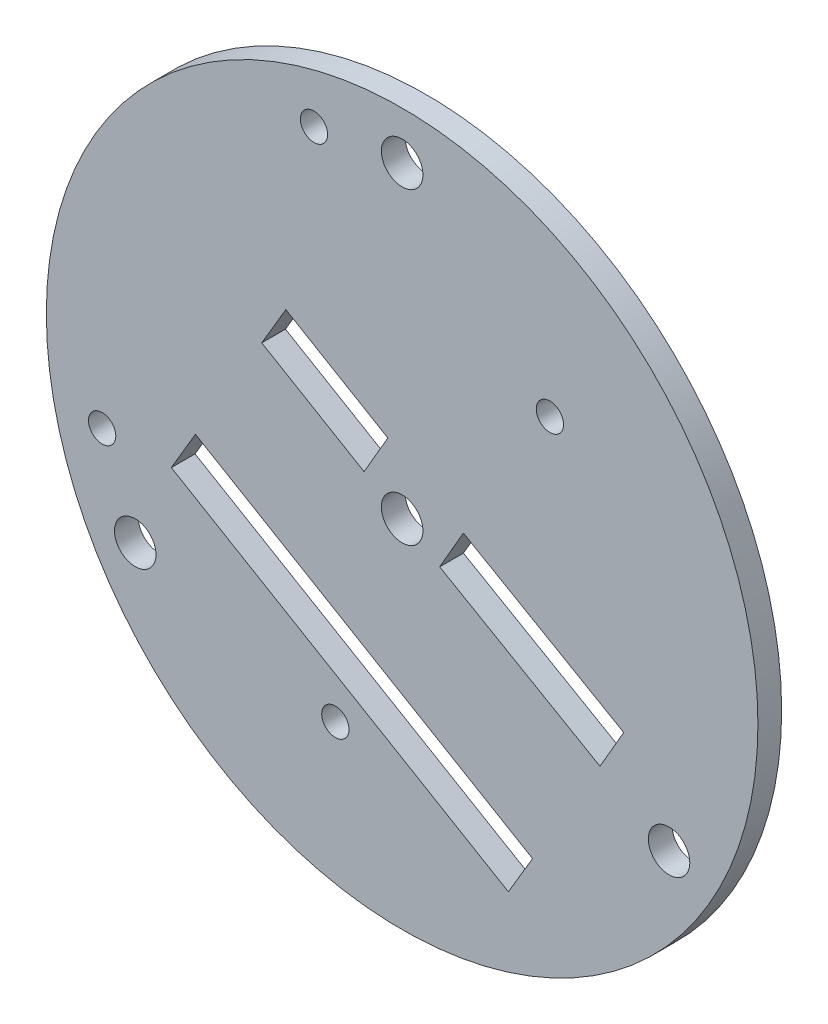
ISO-10303-21;
HEADER;
FILE_DESCRIPTION(('STEP AP214'),'2;1');
FILE_NAME('part.step','',(''),(''),'','','');
FILE_SCHEMA(('AUTOMOTIVE_DESIGN { 1 0 10303 214 1 1 1 1 }'));
ENDSEC;
DATA;
#1=APPLICATION_CONTEXT('core data for automotive mechanical design processes');
#2=APPLICATION_PROTOCOL_DEFINITION('international standard','automotive_design',2000,#1);
#3=PRODUCT_CONTEXT('',#1,'mechanical');
#4=PRODUCT('Part','Part','',(#3));
#5=PRODUCT_RELATED_PRODUCT_CATEGORY('part','',(#4));
#6=PRODUCT_DEFINITION_FORMATION('','',#4);
#7=PRODUCT_DEFINITION_CONTEXT('part definition',#1,'design');
#8=PRODUCT_DEFINITION('design','',#6,#7);
#9=PRODUCT_DEFINITION_SHAPE('','',#8);
#10=(LENGTH_UNIT() NAMED_UNIT(*) SI_UNIT(.MILLI.,.METRE.));
#11=(NAMED_UNIT(*) PLANE_ANGLE_UNIT() SI_UNIT($,.RADIAN.));
#12=(NAMED_UNIT(*) SI_UNIT($,.STERADIAN.) SOLID_ANGLE_UNIT());
#13=UNCERTAINTY_MEASURE_WITH_UNIT(LENGTH_MEASURE(1.E-05),#10,'distance_accuracy_value','');
#14=(GEOMETRIC_REPRESENTATION_CONTEXT(3) GLOBAL_UNCERTAINTY_ASSIGNED_CONTEXT((#13)) GLOBAL_UNIT_ASSIGNED_CONTEXT((#10,
#11,#12)) REPRESENTATION_CONTEXT('',''));
#15=CARTESIAN_POINT('',(0.,0.,0.));
#16=DIRECTION('',(0.,0.,1.));
#17=DIRECTION('',(1.,0.,0.));
#18=AXIS2_PLACEMENT_3D('',#15,#16,#17);
#19=CARTESIAN_POINT('',(0.,0.,2.));
#20=DIRECTION('',(0.,0.,1.));
#21=DIRECTION('',(1.,0.,0.));
#22=AXIS2_PLACEMENT_3D('',#19,#20,#21);
#23=PLANE('',#22);
#24=CARTESIAN_POINT('',(-5.63122734908016,-17.6309684458483,2.));
#25=DIRECTION('',(0.,0.,1.));
#26=DIRECTION('',(1.,0.,0.));
#27=AXIS2_PLACEMENT_3D('',#24,#25,#26);
#28=CIRCLE('',#27,1.1505314281103);
#29=CARTESIAN_POINT('',(-4.48069592096986,-17.6309684458483,2.));
#30=VERTEX_POINT('',#29);
#31=EDGE_CURVE('E270',#30,#30,#28,.T.);
#32=ORIENTED_EDGE('',*,*,#31,.F.);
#33=EDGE_LOOP('',(#32));
#34=FACE_BOUND('',#33,.T.);
#35=CARTESIAN_POINT('',(-25.2920447784925,-6.03139827289424,2.));
#36=DIRECTION('',(0.,0.,1.));
#37=DIRECTION('',(1.,0.,0.));
#38=AXIS2_PLACEMENT_3D('',#35,#36,#37);
#39=CIRCLE('',#38,1.14995724005117);
#40=CARTESIAN_POINT('',(-24.1420875384413,-6.03139827289424,2.));
#41=VERTEX_POINT('',#40);
#42=EDGE_CURVE('E278',#41,#41,#39,.T.);
#43=ORIENTED_EDGE('',*,*,#42,.F.);
#44=EDGE_LOOP('',(#43));
#45=FACE_BOUND('',#44,.T.);
#46=CARTESIAN_POINT('',(12.4578292297231,13.6849244419777,2.));
#47=DIRECTION('',(0.,0.,1.));
#48=DIRECTION('',(1.,0.,0.));
#49=AXIS2_PLACEMENT_3D('',#46,#47,#48);
#50=CIRCLE('',#49,1.15041069373994);
#51=CARTESIAN_POINT('',(13.6082399234631,13.6849244419777,2.));
#52=VERTEX_POINT('',#51);
#53=EDGE_CURVE('E286',#52,#52,#50,.T.);
#54=ORIENTED_EDGE('',*,*,#53,.F.);
#55=EDGE_LOOP('',(#54));
#56=FACE_BOUND('',#55,.T.);
#57=CARTESIAN_POINT('',(-0.000129080320043095,25.9854616573735,2.));
#58=DIRECTION('',(0.,0.,1.));
#59=DIRECTION('',(1.,0.,0.));
#60=AXIS2_PLACEMENT_3D('',#57,#58,#59);
#61=CIRCLE('',#60,1.75028483292731);
#62=CARTESIAN_POINT('',(1.75015575260727,25.9854616573735,2.));
#63=VERTEX_POINT('',#62);
#64=EDGE_CURVE('E151',#63,#63,#61,.T.);
#65=ORIENTED_EDGE('',*,*,#64,.F.);
#66=EDGE_LOOP('',(#65));
#67=FACE_BOUND('',#66,.T.);
#68=CARTESIAN_POINT('',(0.,0.,2.));
#69=DIRECTION('',(0.,0.,1.));
#70=DIRECTION('',(1.,0.,0.));
#71=AXIS2_PLACEMENT_3D('',#68,#69,#70);
#72=CIRCLE('',#71,30.);
#73=CARTESIAN_POINT('',(30.,0.,2.));
#74=VERTEX_POINT('',#73);
#75=EDGE_CURVE('E11',#74,#74,#72,.T.);
#76=ORIENTED_EDGE('',*,*,#75,.T.);
#77=EDGE_LOOP('',(#76));
#78=FACE_BOUND('',#77,.T.);
#79=DIRECTION('',(0.861282267136183,-0.508126811255572,0.));
#80=VECTOR('',#79,1.);
#81=CARTESIAN_POINT('',(-19.4620018005371,-5.98800039291382,2.));
#82=LINE('',#81,#80);
#83=CARTESIAN_POINT('',(-19.4620018005371,-5.98800039291382,2.));
#84=VERTEX_POINT('',#83);
#85=CARTESIAN_POINT('',(8.96000003813613,-22.7560005188255,2.));
#86=VERTEX_POINT('',#85);
#87=EDGE_CURVE('E194',#84,#86,#82,.T.);
#88=ORIENTED_EDGE('',*,*,#87,.F.);
#89=DIRECTION('',(-0.508308313455881,-0.861175161318322,0.));
#90=VECTOR('',#89,1.);
#91=CARTESIAN_POINT('',(-17.4280014038086,-2.54200005531311,2.));
#92=LINE('',#91,#90);
#93=CARTESIAN_POINT('',(-17.4280014038086,-2.54200005531311,2.));
#94=VERTEX_POINT('',#93);
#95=EDGE_CURVE('E192',#94,#84,#92,.T.);
#96=ORIENTED_EDGE('',*,*,#95,.F.);
#97=DIRECTION('',(-0.861255741575103,0.50817176978254,0.));
#98=VECTOR('',#97,1.);
#99=CARTESIAN_POINT('',(-17.4280014038086,-2.54200005531311,2.));
#100=LINE('',#99,#98);
#101=CARTESIAN_POINT('',(10.9940004348755,-19.3120002746582,2.));
#102=VERTEX_POINT('',#101);
#103=EDGE_CURVE('E200',#102,#94,#100,.T.);
#104=ORIENTED_EDGE('',*,*,#103,.F.);
#105=DIRECTION('',(0.508527190170735,0.861045931909011,0.));
#106=VECTOR('',#105,1.);
#107=CARTESIAN_POINT('',(10.9940004348755,-19.3120002746582,2.));
#108=LINE('',#107,#106);
#109=EDGE_CURVE('E197',#86,#102,#108,.T.);
#110=ORIENTED_EDGE('',*,*,#109,.F.);
#111=EDGE_LOOP('',(#88,#96,#104,#110));
#112=FACE_BOUND('',#111,.T.);
#113=DIRECTION('',(0.501193995236525,0.865334951991915,0.));
#114=VECTOR('',#113,1.);
#115=CARTESIAN_POINT('',(-1.20400011539459,5.30000019073485,2.));
#116=LINE('',#115,#114);
#117=CARTESIAN_POINT('',(-3.20800018310547,1.8400000333786,2.));
#118=VERTEX_POINT('',#117);
#119=CARTESIAN_POINT('',(-1.20400011539459,5.30000019073485,2.));
#120=VERTEX_POINT('',#119);
#121=EDGE_CURVE('E163',#118,#120,#116,.T.);
#122=ORIENTED_EDGE('',*,*,#121,.F.);
#123=DIRECTION('',(0.861256151654124,-0.508171074774951,0.));
#124=VECTOR('',#123,1.);
#125=CARTESIAN_POINT('',(-3.20800018310547,1.8400000333786,2.));
#126=LINE('',#125,#124);
#127=CARTESIAN_POINT('',(-11.8380002975464,6.93200016021728,2.));
#128=VERTEX_POINT('',#127);
#129=EDGE_CURVE('E161',#128,#118,#126,.T.);
#130=ORIENTED_EDGE('',*,*,#129,.F.);
#131=DIRECTION('',(-0.508156178943913,-0.861264940538695,0.));
#132=VECTOR('',#131,1.);
#133=CARTESIAN_POINT('',(-11.8380002975464,6.93200016021728,2.));
#134=LINE('',#133,#132);
#135=CARTESIAN_POINT('',(-9.80600070953369,10.3760004043579,2.));
#136=VERTEX_POINT('',#135);
#137=EDGE_CURVE('E169',#136,#128,#134,.T.);
#138=ORIENTED_EDGE('',*,*,#137,.F.);
#139=DIRECTION('',(-0.861233330783953,0.508209749952495,0.));
#140=VECTOR('',#139,1.);
#141=CARTESIAN_POINT('',(-9.80600070953369,10.3760004043579,2.));
#142=LINE('',#141,#140);
#143=EDGE_CURVE('E166',#120,#136,#142,.T.);
#144=ORIENTED_EDGE('',*,*,#143,.F.);
#145=EDGE_LOOP('',(#122,#130,#138,#144));
#146=FACE_BOUND('',#145,.T.);
#147=DIRECTION('',(-0.865987160841261,0.500066232871299,0.));
#148=VECTOR('',#147,1.);
#149=CARTESIAN_POINT('',(18.6820011138916,-6.26200008392334,2.));
#150=LINE('',#149,#148);
#151=CARTESIAN_POINT('',(18.6820011138916,-6.26200008392334,2.));
#152=VERTEX_POINT('',#151);
#153=CARTESIAN_POINT('',(5.16400003433228,1.5440000295639,2.));
#154=VERTEX_POINT('',#153);
#155=EDGE_CURVE('E130',#152,#154,#150,.T.);
#156=ORIENTED_EDGE('',*,*,#155,.F.);
#157=DIRECTION('',(0.500010924376867,0.866019096500644,0.));
#158=VECTOR('',#157,1.);
#159=CARTESIAN_POINT('',(16.6820011138916,-9.72600078582764,2.));
#160=LINE('',#159,#158);
#161=CARTESIAN_POINT('',(16.6820011138916,-9.72600078582764,2.));
#162=VERTEX_POINT('',#161);
#163=EDGE_CURVE('E122',#162,#152,#160,.T.);
#164=ORIENTED_EDGE('',*,*,#163,.F.);
#165=DIRECTION('',(0.866010589893912,-0.500025657533289,0.));
#166=VECTOR('',#165,1.);
#167=CARTESIAN_POINT('',(3.16600012779236,-1.92200005054474,2.));
#168=LINE('',#167,#166);
#169=CARTESIAN_POINT('',(3.16600012779236,-1.92200005054474,2.));
#170=VERTEX_POINT('',#169);
#171=EDGE_CURVE('E145',#170,#162,#168,.T.);
#172=ORIENTED_EDGE('',*,*,#171,.F.);
#173=DIRECTION('',(-0.499419448903043,-0.866360325763698,0.));
#174=VECTOR('',#173,1.);
#175=CARTESIAN_POINT('',(5.16400003433228,1.5440000295639,2.));
#176=LINE('',#175,#174);
#177=EDGE_CURVE('E143',#154,#170,#176,.T.);
#178=ORIENTED_EDGE('',*,*,#177,.F.);
#179=EDGE_LOOP('',(#156,#164,#172,#178));
#180=FACE_BOUND('',#179,.T.);
#181=CARTESIAN_POINT('',(-7.43391304820575,24.9138154517517,2.));
#182=DIRECTION('',(0.,0.,1.));
#183=DIRECTION('',(1.,0.,0.));
#184=AXIS2_PLACEMENT_3D('',#181,#182,#183);
#185=CIRCLE('',#184,1.15037431170066);
#186=CARTESIAN_POINT('',(-6.28353873650509,24.9138154517517,2.));
#187=VERTEX_POINT('',#186);
#188=EDGE_CURVE('E290',#187,#187,#185,.T.);
#189=ORIENTED_EDGE('',*,*,#188,.F.);
#190=EDGE_LOOP('',(#189));
#191=FACE_BOUND('',#190,.T.);
#192=CARTESIAN_POINT('',(22.5038067062868,-12.994703518017,2.));
#193=DIRECTION('',(0.,0.,1.));
#194=DIRECTION('',(1.,0.,0.));
#195=AXIS2_PLACEMENT_3D('',#192,#193,#194);
#196=CIRCLE('',#195,1.75015009371999);
#197=CARTESIAN_POINT('',(24.2539568000068,-12.994703518017,2.));
#198=VERTEX_POINT('',#197);
#199=EDGE_CURVE('E282',#198,#198,#196,.T.);
#200=ORIENTED_EDGE('',*,*,#199,.F.);
#201=EDGE_LOOP('',(#200));
#202=FACE_BOUND('',#201,.T.);
#203=CARTESIAN_POINT('',(-22.5054807553049,-12.993790445526,2.));
#204=DIRECTION('',(0.,0.,1.));
#205=DIRECTION('',(1.,0.,0.));
#206=AXIS2_PLACEMENT_3D('',#203,#204,#205);
#207=CIRCLE('',#206,1.74999903227342);
#208=CARTESIAN_POINT('',(-20.7554817230314,-12.993790445526,2.));
#209=VERTEX_POINT('',#208);
#210=EDGE_CURVE('E274',#209,#209,#207,.T.);
#211=ORIENTED_EDGE('',*,*,#210,.F.);
#212=EDGE_LOOP('',(#211));
#213=FACE_BOUND('',#212,.T.);
#214=CARTESIAN_POINT('',(0.,0.,2.));
#215=DIRECTION('',(0.,0.,1.));
#216=DIRECTION('',(1.,0.,0.));
#217=AXIS2_PLACEMENT_3D('',#214,#215,#216);
#218=CIRCLE('',#217,1.75185048736914);
#219=CARTESIAN_POINT('',(1.75185048736914,0.,2.));
#220=VERTEX_POINT('',#219);
#221=EDGE_CURVE('E265',#220,#220,#218,.T.);
#222=ORIENTED_EDGE('',*,*,#221,.F.);
#223=EDGE_LOOP('',(#222));
#224=FACE_BOUND('',#223,.T.);
#225=ADVANCED_FACE('F33',(#34,#45,#56,#67,#78,#112,#146,#180,#191,#202,#213,#224),#23,.T.);
#226=CARTESIAN_POINT('',(0.,0.,0.));
#227=DIRECTION('',(0.,0.,1.));
#228=DIRECTION('',(1.,0.,0.));
#229=AXIS2_PLACEMENT_3D('',#226,#227,#228);
#230=PLANE('',#229);
#231=DIRECTION('',(0.861256151654124,-0.508171074774951,0.));
#232=VECTOR('',#231,1.);
#233=CARTESIAN_POINT('',(-3.20800018310547,1.8400000333786,0.));
#234=LINE('',#233,#232);
#235=CARTESIAN_POINT('',(-11.8380002975464,6.93200016021728,0.));
#236=VERTEX_POINT('',#235);
#237=CARTESIAN_POINT('',(-3.20800018310547,1.8400000333786,0.));
#238=VERTEX_POINT('',#237);
#239=EDGE_CURVE('E138',#236,#238,#234,.T.);
#240=ORIENTED_EDGE('',*,*,#239,.T.);
#241=DIRECTION('',(0.501193995236525,0.865334951991915,0.));
#242=VECTOR('',#241,1.);
#243=CARTESIAN_POINT('',(-1.20400011539459,5.30000019073485,0.));
#244=LINE('',#243,#242);
#245=CARTESIAN_POINT('',(-1.20400011539459,5.30000019073485,0.));
#246=VERTEX_POINT('',#245);
#247=EDGE_CURVE('E174',#238,#246,#244,.T.);
#248=ORIENTED_EDGE('',*,*,#247,.T.);
#249=DIRECTION('',(-0.861233330783953,0.508209749952495,0.));
#250=VECTOR('',#249,1.);
#251=CARTESIAN_POINT('',(-9.80600070953369,10.3760004043579,0.));
#252=LINE('',#251,#250);
#253=CARTESIAN_POINT('',(-9.80600070953369,10.3760004043579,0.));
#254=VERTEX_POINT('',#253);
#255=EDGE_CURVE('E177',#246,#254,#252,.T.);
#256=ORIENTED_EDGE('',*,*,#255,.T.);
#257=DIRECTION('',(-0.508156178943913,-0.861264940538695,0.));
#258=VECTOR('',#257,1.);
#259=CARTESIAN_POINT('',(-11.8380002975464,6.93200016021728,0.));
#260=LINE('',#259,#258);
#261=EDGE_CURVE('E164',#254,#236,#260,.T.);
#262=ORIENTED_EDGE('',*,*,#261,.T.);
#263=EDGE_LOOP('',(#240,#248,#256,#262));
#264=FACE_BOUND('',#263,.T.);
#265=CARTESIAN_POINT('',(0.,0.,0.));
#266=DIRECTION('',(0.,0.,1.));
#267=DIRECTION('',(1.,0.,0.));
#268=AXIS2_PLACEMENT_3D('',#265,#266,#267);
#269=CIRCLE('',#268,30.);
#270=CARTESIAN_POINT('',(30.,0.,0.));
#271=VERTEX_POINT('',#270);
#272=EDGE_CURVE('E37',#271,#271,#269,.T.);
#273=ORIENTED_EDGE('',*,*,#272,.F.);
#274=EDGE_LOOP('',(#273));
#275=FACE_BOUND('',#274,.T.);
#276=DIRECTION('',(-0.508308313455881,-0.861175161318322,0.));
#277=VECTOR('',#276,1.);
#278=CARTESIAN_POINT('',(-17.4280014038086,-2.54200005531311,0.));
#279=LINE('',#278,#277);
#280=CARTESIAN_POINT('',(-17.4280014038086,-2.54200005531311,0.));
#281=VERTEX_POINT('',#280);
#282=CARTESIAN_POINT('',(-19.4620018005371,-5.98800039291382,0.));
#283=VERTEX_POINT('',#282);
#284=EDGE_CURVE('E191',#281,#283,#279,.T.);
#285=ORIENTED_EDGE('',*,*,#284,.T.);
#286=DIRECTION('',(0.861282267136183,-0.508126811255572,0.));
#287=VECTOR('',#286,1.);
#288=CARTESIAN_POINT('',(-19.4620018005371,-5.98800039291382,0.));
#289=LINE('',#288,#287);
#290=CARTESIAN_POINT('',(8.96000003813613,-22.7560005188255,0.));
#291=VERTEX_POINT('',#290);
#292=EDGE_CURVE('E205',#283,#291,#289,.T.);
#293=ORIENTED_EDGE('',*,*,#292,.T.);
#294=DIRECTION('',(0.508527190170735,0.861045931909011,0.));
#295=VECTOR('',#294,1.);
#296=CARTESIAN_POINT('',(10.9940004348755,-19.3120002746582,0.));
#297=LINE('',#296,#295);
#298=CARTESIAN_POINT('',(10.9940004348755,-19.3120002746582,0.));
#299=VERTEX_POINT('',#298);
#300=EDGE_CURVE('E208',#291,#299,#297,.T.);
#301=ORIENTED_EDGE('',*,*,#300,.T.);
#302=DIRECTION('',(-0.861255741575103,0.50817176978254,0.));
#303=VECTOR('',#302,1.);
#304=CARTESIAN_POINT('',(-17.4280014038086,-2.54200005531311,0.));
#305=LINE('',#304,#303);
#306=EDGE_CURVE('E195',#299,#281,#305,.T.);
#307=ORIENTED_EDGE('',*,*,#306,.T.);
#308=EDGE_LOOP('',(#285,#293,#301,#307));
#309=FACE_BOUND('',#308,.T.);
#310=DIRECTION('',(0.500010924376867,0.866019096500644,0.));
#311=VECTOR('',#310,1.);
#312=CARTESIAN_POINT('',(16.6820011138916,-9.72600078582764,0.));
#313=LINE('',#312,#311);
#314=CARTESIAN_POINT('',(16.6820011138916,-9.72600078582764,0.));
#315=VERTEX_POINT('',#314);
#316=CARTESIAN_POINT('',(18.6820011138916,-6.26200008392334,0.));
#317=VERTEX_POINT('',#316);
#318=EDGE_CURVE('E56',#315,#317,#313,.T.);
#319=ORIENTED_EDGE('',*,*,#318,.T.);
#320=DIRECTION('',(-0.865987160841261,0.500066232871299,0.));
#321=VECTOR('',#320,1.);
#322=CARTESIAN_POINT('',(18.6820011138916,-6.26200008392334,0.));
#323=LINE('',#322,#321);
#324=CARTESIAN_POINT('',(5.16400003433228,1.5440000295639,0.));
#325=VERTEX_POINT('',#324);
#326=EDGE_CURVE('E137',#317,#325,#323,.T.);
#327=ORIENTED_EDGE('',*,*,#326,.T.);
#328=DIRECTION('',(-0.499419448903043,-0.866360325763698,0.));
#329=VECTOR('',#328,1.);
#330=CARTESIAN_POINT('',(5.16400003433228,1.5440000295639,0.));
#331=LINE('',#330,#329);
#332=CARTESIAN_POINT('',(3.16600012779236,-1.92200005054474,0.));
#333=VERTEX_POINT('',#332);
#334=EDGE_CURVE('E153',#325,#333,#331,.T.);
#335=ORIENTED_EDGE('',*,*,#334,.T.);
#336=DIRECTION('',(0.866010589893912,-0.500025657533289,0.));
#337=VECTOR('',#336,1.);
#338=CARTESIAN_POINT('',(3.16600012779236,-1.92200005054474,0.));
#339=LINE('',#338,#337);
#340=EDGE_CURVE('E131',#333,#315,#339,.T.);
#341=ORIENTED_EDGE('',*,*,#340,.T.);
#342=EDGE_LOOP('',(#319,#327,#335,#341));
#343=FACE_BOUND('',#342,.T.);
#344=CARTESIAN_POINT('',(-0.000129080320043095,25.9854616573735,0.));
#345=DIRECTION('',(0.,0.,1.));
#346=DIRECTION('',(1.,0.,0.));
#347=AXIS2_PLACEMENT_3D('',#344,#345,#346);
#348=CIRCLE('',#347,1.75028483292731);
#349=CARTESIAN_POINT('',(1.75015575260727,25.9854616573735,0.));
#350=VERTEX_POINT('',#349);
#351=EDGE_CURVE('E236',#350,#350,#348,.T.);
#352=ORIENTED_EDGE('',*,*,#351,.T.);
#353=EDGE_LOOP('',(#352));
#354=FACE_BOUND('',#353,.T.);
#355=CARTESIAN_POINT('',(-7.43391304820575,24.9138154517517,0.));
#356=DIRECTION('',(0.,0.,1.));
#357=DIRECTION('',(1.,0.,0.));
#358=AXIS2_PLACEMENT_3D('',#355,#356,#357);
#359=CIRCLE('',#358,1.15037431170066);
#360=CARTESIAN_POINT('',(-6.28353873650509,24.9138154517517,0.));
#361=VERTEX_POINT('',#360);
#362=EDGE_CURVE('E240',#361,#361,#359,.T.);
#363=ORIENTED_EDGE('',*,*,#362,.T.);
#364=EDGE_LOOP('',(#363));
#365=FACE_BOUND('',#364,.T.);
#366=CARTESIAN_POINT('',(12.4578292297231,13.6849244419777,0.));
#367=DIRECTION('',(0.,0.,1.));
#368=DIRECTION('',(1.,0.,0.));
#369=AXIS2_PLACEMENT_3D('',#366,#367,#368);
#370=CIRCLE('',#369,1.15041069373994);
#371=CARTESIAN_POINT('',(13.6082399234631,13.6849244419777,0.));
#372=VERTEX_POINT('',#371);
#373=EDGE_CURVE('E244',#372,#372,#370,.T.);
#374=ORIENTED_EDGE('',*,*,#373,.T.);
#375=EDGE_LOOP('',(#374));
#376=FACE_BOUND('',#375,.T.);
#377=CARTESIAN_POINT('',(22.5038067062868,-12.994703518017,0.));
#378=DIRECTION('',(0.,0.,1.));
#379=DIRECTION('',(1.,0.,0.));
#380=AXIS2_PLACEMENT_3D('',#377,#378,#379);
#381=CIRCLE('',#380,1.75015009371999);
#382=CARTESIAN_POINT('',(24.2539568000068,-12.994703518017,0.));
#383=VERTEX_POINT('',#382);
#384=EDGE_CURVE('E248',#383,#383,#381,.T.);
#385=ORIENTED_EDGE('',*,*,#384,.T.);
#386=EDGE_LOOP('',(#385));
#387=FACE_BOUND('',#386,.T.);
#388=CARTESIAN_POINT('',(-25.2920447784925,-6.03139827289424,0.));
#389=DIRECTION('',(0.,0.,1.));
#390=DIRECTION('',(1.,0.,0.));
#391=AXIS2_PLACEMENT_3D('',#388,#389,#390);
#392=CIRCLE('',#391,1.14995724005117);
#393=CARTESIAN_POINT('',(-24.1420875384413,-6.03139827289424,0.));
#394=VERTEX_POINT('',#393);
#395=EDGE_CURVE('E252',#394,#394,#392,.T.);
#396=ORIENTED_EDGE('',*,*,#395,.T.);
#397=EDGE_LOOP('',(#396));
#398=FACE_BOUND('',#397,.T.);
#399=CARTESIAN_POINT('',(-22.5054807553049,-12.993790445526,0.));
#400=DIRECTION('',(0.,0.,1.));
#401=DIRECTION('',(1.,0.,0.));
#402=AXIS2_PLACEMENT_3D('',#399,#400,#401);
#403=CIRCLE('',#402,1.74999903227342);
#404=CARTESIAN_POINT('',(-20.7554817230314,-12.993790445526,0.));
#405=VERTEX_POINT('',#404);
#406=EDGE_CURVE('E256',#405,#405,#403,.T.);
#407=ORIENTED_EDGE('',*,*,#406,.T.);
#408=EDGE_LOOP('',(#407));
#409=FACE_BOUND('',#408,.T.);
#410=CARTESIAN_POINT('',(-5.63122734908016,-17.6309684458483,0.));
#411=DIRECTION('',(0.,0.,1.));
#412=DIRECTION('',(1.,0.,0.));
#413=AXIS2_PLACEMENT_3D('',#410,#411,#412);
#414=CIRCLE('',#413,1.1505314281103);
#415=CARTESIAN_POINT('',(-4.48069592096986,-17.6309684458483,0.));
#416=VERTEX_POINT('',#415);
#417=EDGE_CURVE('E260',#416,#416,#414,.T.);
#418=ORIENTED_EDGE('',*,*,#417,.T.);
#419=EDGE_LOOP('',(#418));
#420=FACE_BOUND('',#419,.T.);
#421=CARTESIAN_POINT('',(0.,0.,0.));
#422=DIRECTION('',(0.,0.,1.));
#423=DIRECTION('',(1.,0.,0.));
#424=AXIS2_PLACEMENT_3D('',#421,#422,#423);
#425=CIRCLE('',#424,1.75185048736914);
#426=CARTESIAN_POINT('',(1.75185048736914,0.,0.));
#427=VERTEX_POINT('',#426);
#428=EDGE_CURVE('E263',#427,#427,#425,.T.);
#429=ORIENTED_EDGE('',*,*,#428,.T.);
#430=EDGE_LOOP('',(#429));
#431=FACE_BOUND('',#430,.T.);
#432=ADVANCED_FACE('F227',(#264,#275,#309,#343,#354,#365,#376,#387,#398,#409,#420,#431),#230,.F.);
#433=CARTESIAN_POINT('',(0.,0.,2.));
#434=DIRECTION('',(0.,0.,-1.));
#435=DIRECTION('',(-1.,0.,0.));
#436=AXIS2_PLACEMENT_3D('',#433,#434,#435);
#437=CYLINDRICAL_SURFACE('',#436,30.);
#438=ORIENTED_EDGE('',*,*,#75,.F.);
#439=EDGE_LOOP('',(#438));
#440=FACE_BOUND('',#439,.T.);
#441=ORIENTED_EDGE('',*,*,#272,.T.);
#442=EDGE_LOOP('',(#441));
#443=FACE_BOUND('',#442,.T.);
#444=ADVANCED_FACE('F35',(#440,#443),#437,.T.);
#445=CARTESIAN_POINT('',(-17.4280014038086,-2.54200005531311,2.));
#446=DIRECTION('',(0.861175161318322,-0.508308313455881,0.));
#447=DIRECTION('',(0.508308313455881,0.861175161318322,0.));
#448=AXIS2_PLACEMENT_3D('',#445,#446,#447);
#449=PLANE('',#448);
#450=ORIENTED_EDGE('',*,*,#284,.F.);
#451=DIRECTION('',(0.,0.,-1.));
#452=VECTOR('',#451,1.);
#453=CARTESIAN_POINT('',(-17.4280014038086,-2.54200005531311,2.));
#454=LINE('',#453,#452);
#455=EDGE_CURVE('E202',#94,#281,#454,.T.);
#456=ORIENTED_EDGE('',*,*,#455,.F.);
#457=ORIENTED_EDGE('',*,*,#95,.T.);
#458=DIRECTION('',(0.,0.,-1.));
#459=VECTOR('',#458,1.);
#460=CARTESIAN_POINT('',(-19.4620018005371,-5.98800039291382,2.));
#461=LINE('',#460,#459);
#462=EDGE_CURVE('E219',#84,#283,#461,.T.);
#463=ORIENTED_EDGE('',*,*,#462,.T.);
#464=EDGE_LOOP('',(#450,#456,#457,#463));
#465=FACE_BOUND('',#464,.T.);
#466=ADVANCED_FACE('F352',(#465),#449,.T.);
#467=CARTESIAN_POINT('',(-19.4620018005371,-5.98800039291382,2.));
#468=DIRECTION('',(0.508126811255572,0.861282267136183,0.));
#469=DIRECTION('',(-0.861282267136183,0.508126811255572,0.));
#470=AXIS2_PLACEMENT_3D('',#467,#468,#469);
#471=PLANE('',#470);
#472=ORIENTED_EDGE('',*,*,#292,.F.);
#473=ORIENTED_EDGE('',*,*,#462,.F.);
#474=ORIENTED_EDGE('',*,*,#87,.T.);
#475=DIRECTION('',(0.,0.,-1.));
#476=VECTOR('',#475,1.);
#477=CARTESIAN_POINT('',(8.96000003813613,-22.7560005188255,2.));
#478=LINE('',#477,#476);
#479=EDGE_CURVE('E217',#86,#291,#478,.T.);
#480=ORIENTED_EDGE('',*,*,#479,.T.);
#481=EDGE_LOOP('',(#472,#473,#474,#480));
#482=FACE_BOUND('',#481,.T.);
#483=ADVANCED_FACE('F348',(#482),#471,.T.);
#484=CARTESIAN_POINT('',(10.9940004348755,-19.3120002746582,2.));
#485=DIRECTION('',(-0.861045931909011,0.508527190170735,0.));
#486=DIRECTION('',(-0.508527190170735,-0.861045931909011,0.));
#487=AXIS2_PLACEMENT_3D('',#484,#485,#486);
#488=PLANE('',#487);
#489=ORIENTED_EDGE('',*,*,#300,.F.);
#490=ORIENTED_EDGE('',*,*,#479,.F.);
#491=ORIENTED_EDGE('',*,*,#109,.T.);
#492=DIRECTION('',(0.,0.,-1.));
#493=VECTOR('',#492,1.);
#494=CARTESIAN_POINT('',(10.9940004348755,-19.3120002746582,2.));
#495=LINE('',#494,#493);
#496=EDGE_CURVE('E215',#102,#299,#495,.T.);
#497=ORIENTED_EDGE('',*,*,#496,.T.);
#498=EDGE_LOOP('',(#489,#490,#491,#497));
#499=FACE_BOUND('',#498,.T.);
#500=ADVANCED_FACE('F344',(#499),#488,.T.);
#501=CARTESIAN_POINT('',(-17.4280014038086,-2.54200005531311,2.));
#502=DIRECTION('',(-0.50817176978254,-0.861255741575103,0.));
#503=DIRECTION('',(0.861255741575103,-0.50817176978254,0.));
#504=AXIS2_PLACEMENT_3D('',#501,#502,#503);
#505=PLANE('',#504);
#506=ORIENTED_EDGE('',*,*,#306,.F.);
#507=ORIENTED_EDGE('',*,*,#496,.F.);
#508=ORIENTED_EDGE('',*,*,#103,.T.);
#509=ORIENTED_EDGE('',*,*,#455,.T.);
#510=EDGE_LOOP('',(#506,#507,#508,#509));
#511=FACE_BOUND('',#510,.T.);
#512=ADVANCED_FACE('F341',(#511),#505,.T.);
#513=CARTESIAN_POINT('',(-3.20800018310547,1.8400000333786,2.));
#514=DIRECTION('',(0.508171074774951,0.861256151654124,0.));
#515=DIRECTION('',(-0.861256151654124,0.508171074774951,0.));
#516=AXIS2_PLACEMENT_3D('',#513,#514,#515);
#517=PLANE('',#516);
#518=ORIENTED_EDGE('',*,*,#239,.F.);
#519=DIRECTION('',(0.,0.,-1.));
#520=VECTOR('',#519,1.);
#521=CARTESIAN_POINT('',(-11.8380002975464,6.93200016021728,2.));
#522=LINE('',#521,#520);
#523=EDGE_CURVE('E171',#128,#236,#522,.T.);
#524=ORIENTED_EDGE('',*,*,#523,.F.);
#525=ORIENTED_EDGE('',*,*,#129,.T.);
#526=DIRECTION('',(0.,0.,-1.));
#527=VECTOR('',#526,1.);
#528=CARTESIAN_POINT('',(-3.20800018310547,1.8400000333786,2.));
#529=LINE('',#528,#527);
#530=EDGE_CURVE('E188',#118,#238,#529,.T.);
#531=ORIENTED_EDGE('',*,*,#530,.T.);
#532=EDGE_LOOP('',(#518,#524,#525,#531));
#533=FACE_BOUND('',#532,.T.);
#534=ADVANCED_FACE('F323',(#533),#517,.T.);
#535=CARTESIAN_POINT('',(-1.20400011539459,5.30000019073485,2.));
#536=DIRECTION('',(-0.865334951991915,0.501193995236525,0.));
#537=DIRECTION('',(-0.501193995236525,-0.865334951991915,0.));
#538=AXIS2_PLACEMENT_3D('',#535,#536,#537);
#539=PLANE('',#538);
#540=ORIENTED_EDGE('',*,*,#247,.F.);
#541=ORIENTED_EDGE('',*,*,#530,.F.);
#542=ORIENTED_EDGE('',*,*,#121,.T.);
#543=DIRECTION('',(0.,0.,-1.));
#544=VECTOR('',#543,1.);
#545=CARTESIAN_POINT('',(-1.20400011539459,5.30000019073485,2.));
#546=LINE('',#545,#544);
#547=EDGE_CURVE('E186',#120,#246,#546,.T.);
#548=ORIENTED_EDGE('',*,*,#547,.T.);
#549=EDGE_LOOP('',(#540,#541,#542,#548));
#550=FACE_BOUND('',#549,.T.);
#551=ADVANCED_FACE('F317',(#550),#539,.T.);
#552=CARTESIAN_POINT('',(-9.80600070953369,10.3760004043579,2.));
#553=DIRECTION('',(-0.508209749952495,-0.861233330783953,0.));
#554=DIRECTION('',(0.861233330783953,-0.508209749952495,0.));
#555=AXIS2_PLACEMENT_3D('',#552,#553,#554);
#556=PLANE('',#555);
#557=ORIENTED_EDGE('',*,*,#255,.F.);
#558=ORIENTED_EDGE('',*,*,#547,.F.);
#559=ORIENTED_EDGE('',*,*,#143,.T.);
#560=DIRECTION('',(0.,0.,-1.));
#561=VECTOR('',#560,1.);
#562=CARTESIAN_POINT('',(-9.80600070953369,10.3760004043579,2.));
#563=LINE('',#562,#561);
#564=EDGE_CURVE('E184',#136,#254,#563,.T.);
#565=ORIENTED_EDGE('',*,*,#564,.T.);
#566=EDGE_LOOP('',(#557,#558,#559,#565));
#567=FACE_BOUND('',#566,.T.);
#568=ADVANCED_FACE('F320',(#567),#556,.T.);
#569=CARTESIAN_POINT('',(-11.8380002975464,6.93200016021728,2.));
#570=DIRECTION('',(0.861264940538695,-0.508156178943913,0.));
#571=DIRECTION('',(0.508156178943914,0.861264940538695,0.));
#572=AXIS2_PLACEMENT_3D('',#569,#570,#571);
#573=PLANE('',#572);
#574=ORIENTED_EDGE('',*,*,#261,.F.);
#575=ORIENTED_EDGE('',*,*,#564,.F.);
#576=ORIENTED_EDGE('',*,*,#137,.T.);
#577=ORIENTED_EDGE('',*,*,#523,.T.);
#578=EDGE_LOOP('',(#574,#575,#576,#577));
#579=FACE_BOUND('',#578,.T.);
#580=ADVANCED_FACE('F326',(#579),#573,.T.);
#581=CARTESIAN_POINT('',(16.6820011138916,-9.72600078582764,2.));
#582=DIRECTION('',(-0.866019096500644,0.500010924376867,0.));
#583=DIRECTION('',(-0.500010924376867,-0.866019096500644,0.));
#584=AXIS2_PLACEMENT_3D('',#581,#582,#583);
#585=PLANE('',#584);
#586=ORIENTED_EDGE('',*,*,#318,.F.);
#587=DIRECTION('',(0.,0.,-1.));
#588=VECTOR('',#587,1.);
#589=CARTESIAN_POINT('',(16.6820011138916,-9.72600078582764,2.));
#590=LINE('',#589,#588);
#591=EDGE_CURVE('E126',#162,#315,#590,.T.);
#592=ORIENTED_EDGE('',*,*,#591,.F.);
#593=ORIENTED_EDGE('',*,*,#163,.T.);
#594=DIRECTION('',(0.,0.,-1.));
#595=VECTOR('',#594,1.);
#596=CARTESIAN_POINT('',(18.6820011138916,-6.26200008392334,2.));
#597=LINE('',#596,#595);
#598=EDGE_CURVE('E125',#152,#317,#597,.T.);
#599=ORIENTED_EDGE('',*,*,#598,.T.);
#600=EDGE_LOOP('',(#586,#592,#593,#599));
#601=FACE_BOUND('',#600,.T.);
#602=ADVANCED_FACE('F124',(#601),#585,.T.);
#603=CARTESIAN_POINT('',(18.6820011138916,-6.26200008392334,2.));
#604=DIRECTION('',(-0.500066232871299,-0.865987160841261,0.));
#605=DIRECTION('',(0.865987160841261,-0.500066232871299,0.));
#606=AXIS2_PLACEMENT_3D('',#603,#604,#605);
#607=PLANE('',#606);
#608=ORIENTED_EDGE('',*,*,#326,.F.);
#609=ORIENTED_EDGE('',*,*,#598,.F.);
#610=ORIENTED_EDGE('',*,*,#155,.T.);
#611=DIRECTION('',(0.,0.,-1.));
#612=VECTOR('',#611,1.);
#613=CARTESIAN_POINT('',(5.16400003433228,1.5440000295639,2.));
#614=LINE('',#613,#612);
#615=EDGE_CURVE('E139',#154,#325,#614,.T.);
#616=ORIENTED_EDGE('',*,*,#615,.T.);
#617=EDGE_LOOP('',(#608,#609,#610,#616));
#618=FACE_BOUND('',#617,.T.);
#619=ADVANCED_FACE('F134',(#618),#607,.T.);
#620=CARTESIAN_POINT('',(5.16400003433228,1.5440000295639,2.));
#621=DIRECTION('',(0.866360325763698,-0.499419448903043,0.));
#622=DIRECTION('',(0.499419448903043,0.866360325763698,0.));
#623=AXIS2_PLACEMENT_3D('',#620,#621,#622);
#624=PLANE('',#623);
#625=ORIENTED_EDGE('',*,*,#334,.F.);
#626=ORIENTED_EDGE('',*,*,#615,.F.);
#627=ORIENTED_EDGE('',*,*,#177,.T.);
#628=DIRECTION('',(0.,0.,-1.));
#629=VECTOR('',#628,1.);
#630=CARTESIAN_POINT('',(3.16600012779236,-1.92200005054474,2.));
#631=LINE('',#630,#629);
#632=EDGE_CURVE('E48',#170,#333,#631,.T.);
#633=ORIENTED_EDGE('',*,*,#632,.T.);
#634=EDGE_LOOP('',(#625,#626,#627,#633));
#635=FACE_BOUND('',#634,.T.);
#636=ADVANCED_FACE('F431',(#635),#624,.T.);
#637=CARTESIAN_POINT('',(3.16600012779236,-1.92200005054474,2.));
#638=DIRECTION('',(0.500025657533289,0.866010589893912,0.));
#639=DIRECTION('',(-0.866010589893912,0.500025657533289,0.));
#640=AXIS2_PLACEMENT_3D('',#637,#638,#639);
#641=PLANE('',#640);
#642=ORIENTED_EDGE('',*,*,#340,.F.);
#643=ORIENTED_EDGE('',*,*,#632,.F.);
#644=ORIENTED_EDGE('',*,*,#171,.T.);
#645=ORIENTED_EDGE('',*,*,#591,.T.);
#646=EDGE_LOOP('',(#642,#643,#644,#645));
#647=FACE_BOUND('',#646,.T.);
#648=ADVANCED_FACE('F438',(#647),#641,.T.);
#649=CARTESIAN_POINT('',(-0.000129080320043095,25.9854616573735,2.));
#650=DIRECTION('',(0.,0.,-1.));
#651=DIRECTION('',(-1.,0.,0.));
#652=AXIS2_PLACEMENT_3D('',#649,#650,#651);
#653=CYLINDRICAL_SURFACE('',#652,1.75028483292731);
#654=ORIENTED_EDGE('',*,*,#64,.T.);
#655=EDGE_LOOP('',(#654));
#656=FACE_BOUND('',#655,.T.);
#657=ORIENTED_EDGE('',*,*,#351,.F.);
#658=EDGE_LOOP('',(#657));
#659=FACE_BOUND('',#658,.T.);
#660=ADVANCED_FACE('F297',(#656,#659),#653,.F.);
#661=CARTESIAN_POINT('',(-7.43391304820575,24.9138154517517,2.));
#662=DIRECTION('',(0.,0.,-1.));
#663=DIRECTION('',(-1.,0.,0.));
#664=AXIS2_PLACEMENT_3D('',#661,#662,#663);
#665=CYLINDRICAL_SURFACE('',#664,1.15037431170066);
#666=ORIENTED_EDGE('',*,*,#188,.T.);
#667=EDGE_LOOP('',(#666));
#668=FACE_BOUND('',#667,.T.);
#669=ORIENTED_EDGE('',*,*,#362,.F.);
#670=EDGE_LOOP('',(#669));
#671=FACE_BOUND('',#670,.T.);
#672=ADVANCED_FACE('F454',(#668,#671),#665,.F.);
#673=CARTESIAN_POINT('',(12.4578292297231,13.6849244419777,2.));
#674=DIRECTION('',(0.,0.,-1.));
#675=DIRECTION('',(-1.,0.,0.));
#676=AXIS2_PLACEMENT_3D('',#673,#674,#675);
#677=CYLINDRICAL_SURFACE('',#676,1.15041069373994);
#678=ORIENTED_EDGE('',*,*,#53,.T.);
#679=EDGE_LOOP('',(#678));
#680=FACE_BOUND('',#679,.T.);
#681=ORIENTED_EDGE('',*,*,#373,.F.);
#682=EDGE_LOOP('',(#681));
#683=FACE_BOUND('',#682,.T.);
#684=ADVANCED_FACE('F462',(#680,#683),#677,.F.);
#685=CARTESIAN_POINT('',(22.5038067062868,-12.994703518017,2.));
#686=DIRECTION('',(0.,0.,-1.));
#687=DIRECTION('',(-1.,0.,0.));
#688=AXIS2_PLACEMENT_3D('',#685,#686,#687);
#689=CYLINDRICAL_SURFACE('',#688,1.75015009371999);
#690=ORIENTED_EDGE('',*,*,#199,.T.);
#691=EDGE_LOOP('',(#690));
#692=FACE_BOUND('',#691,.T.);
#693=ORIENTED_EDGE('',*,*,#384,.F.);
#694=EDGE_LOOP('',(#693));
#695=FACE_BOUND('',#694,.T.);
#696=ADVANCED_FACE('F471',(#692,#695),#689,.F.);
#697=CARTESIAN_POINT('',(-25.2920447784925,-6.03139827289424,2.));
#698=DIRECTION('',(0.,0.,-1.));
#699=DIRECTION('',(-1.,0.,0.));
#700=AXIS2_PLACEMENT_3D('',#697,#698,#699);
#701=CYLINDRICAL_SURFACE('',#700,1.14995724005117);
#702=ORIENTED_EDGE('',*,*,#42,.T.);
#703=EDGE_LOOP('',(#702));
#704=FACE_BOUND('',#703,.T.);
#705=ORIENTED_EDGE('',*,*,#395,.F.);
#706=EDGE_LOOP('',(#705));
#707=FACE_BOUND('',#706,.T.);
#708=ADVANCED_FACE('F480',(#704,#707),#701,.F.);
#709=CARTESIAN_POINT('',(-22.5054807553049,-12.993790445526,2.));
#710=DIRECTION('',(0.,0.,-1.));
#711=DIRECTION('',(-1.,0.,0.));
#712=AXIS2_PLACEMENT_3D('',#709,#710,#711);
#713=CYLINDRICAL_SURFACE('',#712,1.74999903227342);
#714=ORIENTED_EDGE('',*,*,#210,.T.);
#715=EDGE_LOOP('',(#714));
#716=FACE_BOUND('',#715,.T.);
#717=ORIENTED_EDGE('',*,*,#406,.F.);
#718=EDGE_LOOP('',(#717));
#719=FACE_BOUND('',#718,.T.);
#720=ADVANCED_FACE('F489',(#716,#719),#713,.F.);
#721=CARTESIAN_POINT('',(-5.63122734908016,-17.6309684458483,2.));
#722=DIRECTION('',(0.,0.,-1.));
#723=DIRECTION('',(-1.,0.,0.));
#724=AXIS2_PLACEMENT_3D('',#721,#722,#723);
#725=CYLINDRICAL_SURFACE('',#724,1.1505314281103);
#726=ORIENTED_EDGE('',*,*,#31,.T.);
#727=EDGE_LOOP('',(#726));
#728=FACE_BOUND('',#727,.T.);
#729=ORIENTED_EDGE('',*,*,#417,.F.);
#730=EDGE_LOOP('',(#729));
#731=FACE_BOUND('',#730,.T.);
#732=ADVANCED_FACE('F498',(#728,#731),#725,.F.);
#733=CARTESIAN_POINT('',(0.,0.,2.));
#734=DIRECTION('',(0.,0.,-1.));
#735=DIRECTION('',(-1.,0.,0.));
#736=AXIS2_PLACEMENT_3D('',#733,#734,#735);
#737=CYLINDRICAL_SURFACE('',#736,1.75185048736914);
#738=ORIENTED_EDGE('',*,*,#221,.T.);
#739=EDGE_LOOP('',(#738));
#740=FACE_BOUND('',#739,.T.);
#741=ORIENTED_EDGE('',*,*,#428,.F.);
#742=EDGE_LOOP('',(#741));
#743=FACE_BOUND('',#742,.T.);
#744=ADVANCED_FACE('F507',(#740,#743),#737,.F.);
#745=CLOSED_SHELL('',(#225,#432,#444,#466,#483,#500,#512,#534,#551,#568,#580,#602,#619,#636,
#648,#660,#672,#684,#696,#708,#720,#732,#744));
#746=MANIFOLD_SOLID_BREP('B2',#745);
#747=ADVANCED_BREP_SHAPE_REPRESENTATION('',(#18,#746),#14);
#748=SHAPE_DEFINITION_REPRESENTATION(#9,#747);
ENDSEC;
END-ISO-10303-21;
